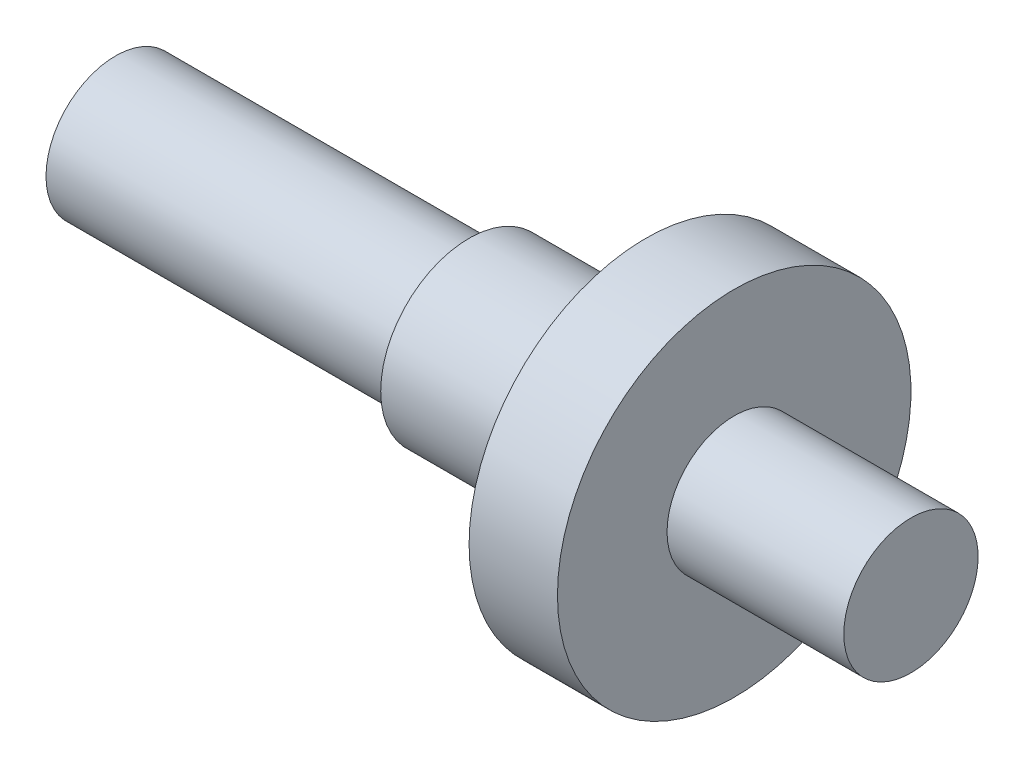
ISO-10303-21;
HEADER;
FILE_DESCRIPTION(('STEP AP214'),'2;1');
FILE_NAME('part.step','',(''),(''),'','','');
FILE_SCHEMA(('AUTOMOTIVE_DESIGN { 1 0 10303 214 1 1 1 1 }'));
ENDSEC;
DATA;
#1=APPLICATION_CONTEXT('core data for automotive mechanical design processes');
#2=APPLICATION_PROTOCOL_DEFINITION('international standard','automotive_design',2000,#1);
#3=PRODUCT_CONTEXT('',#1,'mechanical');
#4=PRODUCT('Part','Part','',(#3));
#5=PRODUCT_RELATED_PRODUCT_CATEGORY('part','',(#4));
#6=PRODUCT_DEFINITION_FORMATION('','',#4);
#7=PRODUCT_DEFINITION_CONTEXT('part definition',#1,'design');
#8=PRODUCT_DEFINITION('design','',#6,#7);
#9=PRODUCT_DEFINITION_SHAPE('','',#8);
#10=(LENGTH_UNIT() NAMED_UNIT(*) SI_UNIT(.MILLI.,.METRE.));
#11=(NAMED_UNIT(*) PLANE_ANGLE_UNIT() SI_UNIT($,.RADIAN.));
#12=(NAMED_UNIT(*) SI_UNIT($,.STERADIAN.) SOLID_ANGLE_UNIT());
#13=UNCERTAINTY_MEASURE_WITH_UNIT(LENGTH_MEASURE(1.E-05),#10,'distance_accuracy_value','');
#14=(GEOMETRIC_REPRESENTATION_CONTEXT(3) GLOBAL_UNCERTAINTY_ASSIGNED_CONTEXT((#13)) GLOBAL_UNIT_ASSIGNED_CONTEXT((#10,
#11,#12)) REPRESENTATION_CONTEXT('',''));
#15=CARTESIAN_POINT('',(0.,0.,0.));
#16=DIRECTION('',(0.,0.,1.));
#17=DIRECTION('',(1.,0.,0.));
#18=AXIS2_PLACEMENT_3D('',#15,#16,#17);
#19=CARTESIAN_POINT('',(-19.05,2.5,0.));
#20=DIRECTION('',(1.,0.,0.));
#21=DIRECTION('',(0.,0.,-1.));
#22=AXIS2_PLACEMENT_3D('',#19,#20,#21);
#23=PLANE('',#22);
#24=CARTESIAN_POINT('',(-19.05,0.,0.));
#25=DIRECTION('',(-1.,0.,0.));
#26=DIRECTION('',(0.,0.,1.));
#27=AXIS2_PLACEMENT_3D('',#24,#25,#26);
#28=CIRCLE('',#27,2.5);
#29=CARTESIAN_POINT('',(-19.05,0.,2.5));
#30=VERTEX_POINT('',#29);
#31=EDGE_CURVE('E72',#30,#30,#28,.T.);
#32=ORIENTED_EDGE('',*,*,#31,.T.);
#33=EDGE_LOOP('',(#32));
#34=FACE_BOUND('',#33,.T.);
#35=ADVANCED_FACE('F37',(#34),#23,.F.);
#36=CARTESIAN_POINT('',(9.525,0.,0.));
#37=DIRECTION('',(-1.,0.,0.));
#38=DIRECTION('',(0.,0.,1.));
#39=AXIS2_PLACEMENT_3D('',#36,#37,#38);
#40=PLANE('',#39);
#41=CARTESIAN_POINT('',(9.525,0.,0.));
#42=DIRECTION('',(-1.,0.,0.));
#43=DIRECTION('',(0.,0.,1.));
#44=AXIS2_PLACEMENT_3D('',#41,#42,#43);
#45=CIRCLE('',#44,2.413);
#46=CARTESIAN_POINT('',(9.525,0.,2.413));
#47=VERTEX_POINT('',#46);
#48=EDGE_CURVE('E10',#47,#47,#45,.T.);
#49=ORIENTED_EDGE('',*,*,#48,.F.);
#50=EDGE_LOOP('',(#49));
#51=FACE_BOUND('',#50,.T.);
#52=ADVANCED_FACE('F115',(#51),#40,.F.);
#53=CARTESIAN_POINT('',(-19.05,0.,0.));
#54=DIRECTION('',(-1.,0.,0.));
#55=DIRECTION('',(0.,0.,1.));
#56=AXIS2_PLACEMENT_3D('',#53,#54,#55);
#57=CYLINDRICAL_SURFACE('',#56,2.413);
#58=CARTESIAN_POINT('',(3.175,0.,0.));
#59=DIRECTION('',(-1.,0.,0.));
#60=DIRECTION('',(0.,0.,1.));
#61=AXIS2_PLACEMENT_3D('',#58,#59,#60);
#62=CIRCLE('',#61,2.413);
#63=CARTESIAN_POINT('',(3.175,0.,2.413));
#64=VERTEX_POINT('',#63);
#65=EDGE_CURVE('E44',#64,#64,#62,.T.);
#66=ORIENTED_EDGE('',*,*,#65,.F.);
#67=EDGE_LOOP('',(#66));
#68=FACE_BOUND('',#67,.T.);
#69=ORIENTED_EDGE('',*,*,#48,.T.);
#70=EDGE_LOOP('',(#69));
#71=FACE_BOUND('',#70,.T.);
#72=ADVANCED_FACE('F110',(#68,#71),#57,.T.);
#73=CARTESIAN_POINT('',(3.175,2.413,0.));
#74=DIRECTION('',(-1.,0.,0.));
#75=DIRECTION('',(0.,0.,1.));
#76=AXIS2_PLACEMENT_3D('',#73,#74,#75);
#77=PLANE('',#76);
#78=CARTESIAN_POINT('',(3.175,0.,0.));
#79=DIRECTION('',(-1.,0.,0.));
#80=DIRECTION('',(0.,0.,1.));
#81=AXIS2_PLACEMENT_3D('',#78,#79,#80);
#82=CIRCLE('',#81,6.35);
#83=CARTESIAN_POINT('',(3.175,0.,6.35));
#84=VERTEX_POINT('',#83);
#85=EDGE_CURVE('E50',#84,#84,#82,.T.);
#86=ORIENTED_EDGE('',*,*,#85,.F.);
#87=EDGE_LOOP('',(#86));
#88=FACE_BOUND('',#87,.T.);
#89=ORIENTED_EDGE('',*,*,#65,.T.);
#90=EDGE_LOOP('',(#89));
#91=FACE_BOUND('',#90,.T.);
#92=ADVANCED_FACE('F105',(#88,#91),#77,.F.);
#93=CARTESIAN_POINT('',(-19.05,0.,0.));
#94=DIRECTION('',(-1.,0.,0.));
#95=DIRECTION('',(0.,0.,1.));
#96=AXIS2_PLACEMENT_3D('',#93,#94,#95);
#97=CYLINDRICAL_SURFACE('',#96,6.35);
#98=CARTESIAN_POINT('',(0.,0.,0.));
#99=DIRECTION('',(-1.,0.,0.));
#100=DIRECTION('',(0.,0.,1.));
#101=AXIS2_PLACEMENT_3D('',#98,#99,#100);
#102=CIRCLE('',#101,6.35);
#103=CARTESIAN_POINT('',(0.,0.,6.35));
#104=VERTEX_POINT('',#103);
#105=EDGE_CURVE('E55',#104,#104,#102,.T.);
#106=ORIENTED_EDGE('',*,*,#105,.F.);
#107=EDGE_LOOP('',(#106));
#108=FACE_BOUND('',#107,.T.);
#109=ORIENTED_EDGE('',*,*,#85,.T.);
#110=EDGE_LOOP('',(#109));
#111=FACE_BOUND('',#110,.T.);
#112=ADVANCED_FACE('F99',(#108,#111),#97,.T.);
#113=CARTESIAN_POINT('',(0.,6.35,0.));
#114=DIRECTION('',(1.,0.,0.));
#115=DIRECTION('',(0.,0.,-1.));
#116=AXIS2_PLACEMENT_3D('',#113,#114,#115);
#117=PLANE('',#116);
#118=CARTESIAN_POINT('',(0.,0.,0.));
#119=DIRECTION('',(-1.,0.,0.));
#120=DIRECTION('',(0.,0.,1.));
#121=AXIS2_PLACEMENT_3D('',#118,#119,#120);
#122=CIRCLE('',#121,3.175);
#123=CARTESIAN_POINT('',(0.,0.,3.175));
#124=VERTEX_POINT('',#123);
#125=EDGE_CURVE('E61',#124,#124,#122,.T.);
#126=ORIENTED_EDGE('',*,*,#125,.F.);
#127=EDGE_LOOP('',(#126));
#128=FACE_BOUND('',#127,.T.);
#129=ORIENTED_EDGE('',*,*,#105,.T.);
#130=EDGE_LOOP('',(#129));
#131=FACE_BOUND('',#130,.T.);
#132=ADVANCED_FACE('F93',(#128,#131),#117,.F.);
#133=CARTESIAN_POINT('',(-19.05,0.,0.));
#134=DIRECTION('',(-1.,0.,0.));
#135=DIRECTION('',(0.,0.,1.));
#136=AXIS2_PLACEMENT_3D('',#133,#134,#135);
#137=CYLINDRICAL_SURFACE('',#136,3.175);
#138=CARTESIAN_POINT('',(-6.35,0.,0.));
#139=DIRECTION('',(-1.,0.,0.));
#140=DIRECTION('',(0.,0.,1.));
#141=AXIS2_PLACEMENT_3D('',#138,#139,#140);
#142=CIRCLE('',#141,3.175);
#143=CARTESIAN_POINT('',(-6.35,0.,3.175));
#144=VERTEX_POINT('',#143);
#145=EDGE_CURVE('E64',#144,#144,#142,.T.);
#146=ORIENTED_EDGE('',*,*,#145,.F.);
#147=EDGE_LOOP('',(#146));
#148=FACE_BOUND('',#147,.T.);
#149=ORIENTED_EDGE('',*,*,#125,.T.);
#150=EDGE_LOOP('',(#149));
#151=FACE_BOUND('',#150,.T.);
#152=ADVANCED_FACE('F87',(#148,#151),#137,.T.);
#153=CARTESIAN_POINT('',(-6.35,3.175,0.));
#154=DIRECTION('',(1.,0.,0.));
#155=DIRECTION('',(0.,0.,-1.));
#156=AXIS2_PLACEMENT_3D('',#153,#154,#155);
#157=PLANE('',#156);
#158=CARTESIAN_POINT('',(-6.35,0.,0.));
#159=DIRECTION('',(-1.,0.,0.));
#160=DIRECTION('',(0.,0.,1.));
#161=AXIS2_PLACEMENT_3D('',#158,#159,#160);
#162=CIRCLE('',#161,2.5);
#163=CARTESIAN_POINT('',(-6.35,0.,2.5));
#164=VERTEX_POINT('',#163);
#165=EDGE_CURVE('E68',#164,#164,#162,.T.);
#166=ORIENTED_EDGE('',*,*,#165,.F.);
#167=EDGE_LOOP('',(#166));
#168=FACE_BOUND('',#167,.T.);
#169=ORIENTED_EDGE('',*,*,#145,.T.);
#170=EDGE_LOOP('',(#169));
#171=FACE_BOUND('',#170,.T.);
#172=ADVANCED_FACE('F81',(#168,#171),#157,.F.);
#173=CARTESIAN_POINT('',(-19.05,0.,0.));
#174=DIRECTION('',(-1.,0.,0.));
#175=DIRECTION('',(0.,0.,1.));
#176=AXIS2_PLACEMENT_3D('',#173,#174,#175);
#177=CYLINDRICAL_SURFACE('',#176,2.5);
#178=ORIENTED_EDGE('',*,*,#31,.F.);
#179=EDGE_LOOP('',(#178));
#180=FACE_BOUND('',#179,.T.);
#181=ORIENTED_EDGE('',*,*,#165,.T.);
#182=EDGE_LOOP('',(#181));
#183=FACE_BOUND('',#182,.T.);
#184=ADVANCED_FACE('F78',(#180,#183),#177,.T.);
#185=CLOSED_SHELL('',(#35,#52,#72,#92,#112,#132,#152,#172,#184));
#186=MANIFOLD_SOLID_BREP('B2',#185);
#187=ADVANCED_BREP_SHAPE_REPRESENTATION('',(#18,#186),#14);
#188=SHAPE_DEFINITION_REPRESENTATION(#9,#187);
ENDSEC;
END-ISO-10303-21;
